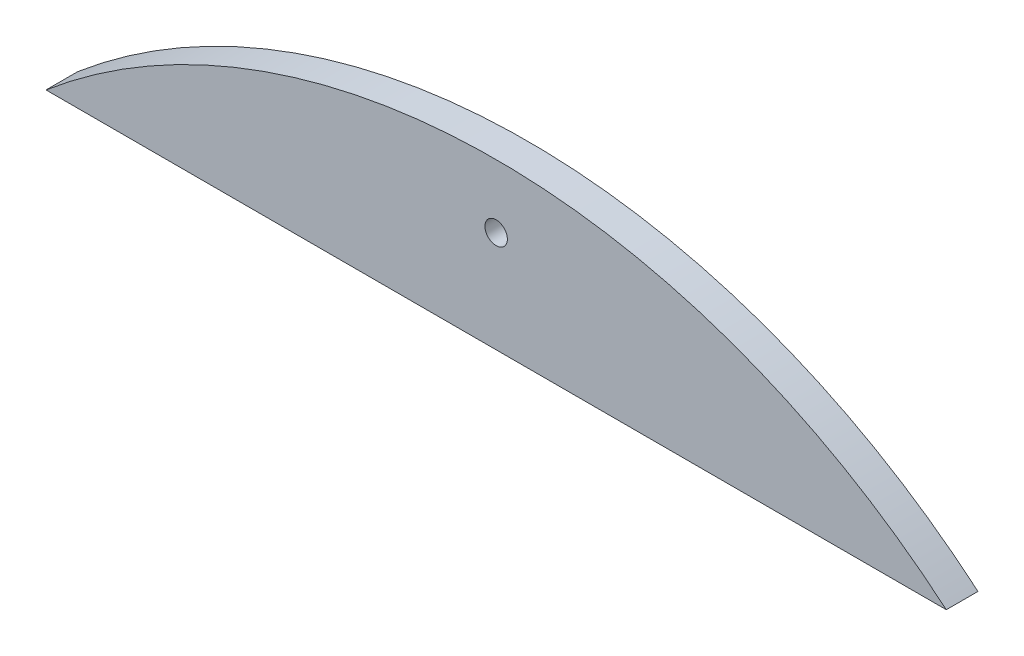
ISO-10303-21;
HEADER;
FILE_DESCRIPTION(('STEP AP214'),'2;1');
FILE_NAME('part.step','',(''),(''),'','','');
FILE_SCHEMA(('AUTOMOTIVE_DESIGN { 1 0 10303 214 1 1 1 1 }'));
ENDSEC;
DATA;
#1=APPLICATION_CONTEXT('core data for automotive mechanical design processes');
#2=APPLICATION_PROTOCOL_DEFINITION('international standard','automotive_design',2000,#1);
#3=PRODUCT_CONTEXT('',#1,'mechanical');
#4=PRODUCT('Part','Part','',(#3));
#5=PRODUCT_RELATED_PRODUCT_CATEGORY('part','',(#4));
#6=PRODUCT_DEFINITION_FORMATION('','',#4);
#7=PRODUCT_DEFINITION_CONTEXT('part definition',#1,'design');
#8=PRODUCT_DEFINITION('design','',#6,#7);
#9=PRODUCT_DEFINITION_SHAPE('','',#8);
#10=(LENGTH_UNIT() NAMED_UNIT(*) SI_UNIT(.MILLI.,.METRE.));
#11=(NAMED_UNIT(*) PLANE_ANGLE_UNIT() SI_UNIT($,.RADIAN.));
#12=(NAMED_UNIT(*) SI_UNIT($,.STERADIAN.) SOLID_ANGLE_UNIT());
#13=UNCERTAINTY_MEASURE_WITH_UNIT(LENGTH_MEASURE(1.E-05),#10,'distance_accuracy_value','');
#14=(GEOMETRIC_REPRESENTATION_CONTEXT(3) GLOBAL_UNCERTAINTY_ASSIGNED_CONTEXT((#13)) GLOBAL_UNIT_ASSIGNED_CONTEXT((#10,
#11,#12)) REPRESENTATION_CONTEXT('',''));
#15=CARTESIAN_POINT('',(0.,0.,0.));
#16=DIRECTION('',(0.,0.,1.));
#17=DIRECTION('',(1.,0.,0.));
#18=AXIS2_PLACEMENT_3D('',#15,#16,#17);
#19=CARTESIAN_POINT('',(7.30418897685165E-13,106.68,6.35));
#20=DIRECTION('',(0.,1.,0.));
#21=DIRECTION('',(-1.,0.,0.));
#22=AXIS2_PLACEMENT_3D('',#19,#20,#21);
#23=PLANE('',#22);
#24=DIRECTION('',(1.,0.,0.));
#25=VECTOR('',#24,1.);
#26=CARTESIAN_POINT('',(7.30418897685165E-13,106.68,0.));
#27=LINE('',#26,#25);
#28=CARTESIAN_POINT('',(-90.1968269951879,106.680000000001,0.));
#29=VERTEX_POINT('',#28);
#30=CARTESIAN_POINT('',(90.1968269951894,106.679999999999,0.));
#31=VERTEX_POINT('',#30);
#32=EDGE_CURVE('E74',#29,#31,#27,.T.);
#33=ORIENTED_EDGE('',*,*,#32,.T.);
#34=DIRECTION('',(0.,0.,-1.));
#35=VECTOR('',#34,1.);
#36=CARTESIAN_POINT('',(90.1968269951894,106.679999999999,6.35));
#37=LINE('',#36,#35);
#38=CARTESIAN_POINT('',(90.1968269951894,106.679999999999,6.35));
#39=VERTEX_POINT('',#38);
#40=EDGE_CURVE('E11',#39,#31,#37,.T.);
#41=ORIENTED_EDGE('',*,*,#40,.F.);
#42=DIRECTION('',(1.,0.,0.));
#43=VECTOR('',#42,1.);
#44=CARTESIAN_POINT('',(7.30418897685165E-13,106.68,6.35));
#45=LINE('',#44,#43);
#46=CARTESIAN_POINT('',(-90.1968269951879,106.680000000001,6.35));
#47=VERTEX_POINT('',#46);
#48=EDGE_CURVE('E73',#47,#39,#45,.T.);
#49=ORIENTED_EDGE('',*,*,#48,.F.);
#50=DIRECTION('',(0.,0.,-1.));
#51=VECTOR('',#50,1.);
#52=CARTESIAN_POINT('',(-90.1968269951879,106.680000000001,6.35));
#53=LINE('',#52,#51);
#54=EDGE_CURVE('E50',#47,#29,#53,.T.);
#55=ORIENTED_EDGE('',*,*,#54,.T.);
#56=EDGE_LOOP('',(#33,#41,#49,#55));
#57=FACE_BOUND('',#56,.T.);
#58=ADVANCED_FACE('F41',(#57),#23,.F.);
#59=CARTESIAN_POINT('',(0.,0.,6.35));
#60=DIRECTION('',(0.,0.,-1.));
#61=DIRECTION('',(-1.,0.,0.));
#62=AXIS2_PLACEMENT_3D('',#59,#60,#61);
#63=CYLINDRICAL_SURFACE('',#62,139.7);
#64=CARTESIAN_POINT('',(0.,0.,0.));
#65=DIRECTION('',(0.,0.,1.));
#66=DIRECTION('',(1.,0.,0.));
#67=AXIS2_PLACEMENT_3D('',#64,#65,#66);
#68=CIRCLE('',#67,139.7);
#69=EDGE_CURVE('E65',#31,#29,#68,.T.);
#70=ORIENTED_EDGE('',*,*,#69,.T.);
#71=ORIENTED_EDGE('',*,*,#54,.F.);
#72=CARTESIAN_POINT('',(0.,0.,6.35));
#73=DIRECTION('',(0.,0.,1.));
#74=DIRECTION('',(1.,0.,0.));
#75=AXIS2_PLACEMENT_3D('',#72,#73,#74);
#76=CIRCLE('',#75,139.7);
#77=EDGE_CURVE('E57',#39,#47,#76,.T.);
#78=ORIENTED_EDGE('',*,*,#77,.F.);
#79=ORIENTED_EDGE('',*,*,#40,.T.);
#80=EDGE_LOOP('',(#70,#71,#78,#79));
#81=FACE_BOUND('',#80,.T.);
#82=ADVANCED_FACE('F68',(#81),#63,.T.);
#83=CARTESIAN_POINT('',(0.,0.,6.35));
#84=DIRECTION('',(0.,0.,1.));
#85=DIRECTION('',(1.,0.,0.));
#86=AXIS2_PLACEMENT_3D('',#83,#84,#85);
#87=PLANE('',#86);
#88=CARTESIAN_POINT('',(0.,127.,6.35));
#89=DIRECTION('',(0.,0.,1.));
#90=DIRECTION('',(1.,0.,0.));
#91=AXIS2_PLACEMENT_3D('',#88,#89,#90);
#92=CIRCLE('',#91,2.2479);
#93=CARTESIAN_POINT('',(2.2479,127.,6.35));
#94=VERTEX_POINT('',#93);
#95=EDGE_CURVE('E84',#94,#94,#92,.T.);
#96=ORIENTED_EDGE('',*,*,#95,.F.);
#97=EDGE_LOOP('',(#96));
#98=FACE_BOUND('',#97,.T.);
#99=ORIENTED_EDGE('',*,*,#48,.T.);
#100=ORIENTED_EDGE('',*,*,#77,.T.);
#101=EDGE_LOOP('',(#99,#100));
#102=FACE_BOUND('',#101,.T.);
#103=ADVANCED_FACE('F97',(#98,#102),#87,.T.);
#104=CARTESIAN_POINT('',(0.,0.,0.));
#105=DIRECTION('',(0.,0.,1.));
#106=DIRECTION('',(1.,0.,0.));
#107=AXIS2_PLACEMENT_3D('',#104,#105,#106);
#108=PLANE('',#107);
#109=CARTESIAN_POINT('',(0.,127.,0.));
#110=DIRECTION('',(0.,0.,1.));
#111=DIRECTION('',(1.,0.,0.));
#112=AXIS2_PLACEMENT_3D('',#109,#110,#111);
#113=CIRCLE('',#112,2.2479);
#114=CARTESIAN_POINT('',(2.2479,127.,0.));
#115=VERTEX_POINT('',#114);
#116=EDGE_CURVE('E80',#115,#115,#113,.T.);
#117=ORIENTED_EDGE('',*,*,#116,.T.);
#118=EDGE_LOOP('',(#117));
#119=FACE_BOUND('',#118,.T.);
#120=ORIENTED_EDGE('',*,*,#32,.F.);
#121=ORIENTED_EDGE('',*,*,#69,.F.);
#122=EDGE_LOOP('',(#120,#121));
#123=FACE_BOUND('',#122,.T.);
#124=ADVANCED_FACE('F78',(#119,#123),#108,.F.);
#125=CARTESIAN_POINT('',(0.,127.,6.35));
#126=DIRECTION('',(0.,0.,1.));
#127=DIRECTION('',(1.,0.,0.));
#128=AXIS2_PLACEMENT_3D('',#125,#126,#127);
#129=CYLINDRICAL_SURFACE('',#128,2.2479);
#130=ORIENTED_EDGE('',*,*,#116,.F.);
#131=EDGE_LOOP('',(#130));
#132=FACE_BOUND('',#131,.T.);
#133=ORIENTED_EDGE('',*,*,#95,.T.);
#134=EDGE_LOOP('',(#133));
#135=FACE_BOUND('',#134,.T.);
#136=ADVANCED_FACE('F95',(#132,#135),#129,.F.);
#137=CLOSED_SHELL('',(#58,#82,#103,#124,#136));
#138=MANIFOLD_SOLID_BREP('B2',#137);
#139=ADVANCED_BREP_SHAPE_REPRESENTATION('',(#18,#138),#14);
#140=SHAPE_DEFINITION_REPRESENTATION(#9,#139);
ENDSEC;
END-ISO-10303-21;
